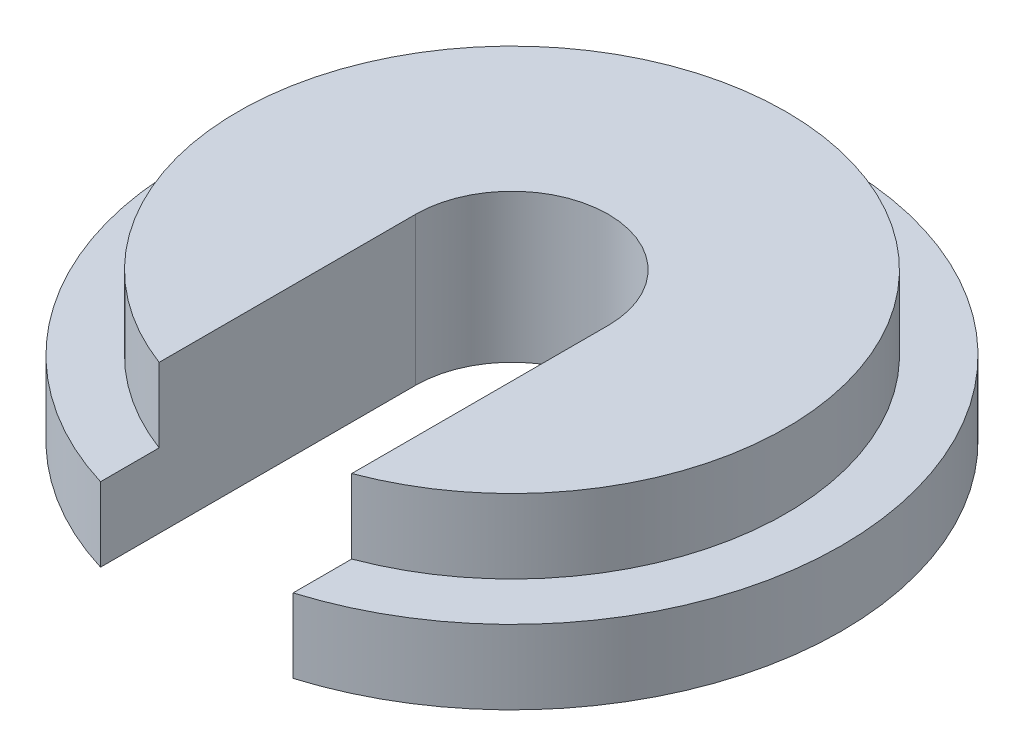
ISO-10303-21;
HEADER;
FILE_DESCRIPTION(('STEP AP214'),'2;1');
FILE_NAME('part.step','',(''),(''),'','','');
FILE_SCHEMA(('AUTOMOTIVE_DESIGN { 1 0 10303 214 1 1 1 1 }'));
ENDSEC;
DATA;
#1=APPLICATION_CONTEXT('core data for automotive mechanical design processes');
#2=APPLICATION_PROTOCOL_DEFINITION('international standard','automotive_design',2000,#1);
#3=PRODUCT_CONTEXT('',#1,'mechanical');
#4=PRODUCT('Part','Part','',(#3));
#5=PRODUCT_RELATED_PRODUCT_CATEGORY('part','',(#4));
#6=PRODUCT_DEFINITION_FORMATION('','',#4);
#7=PRODUCT_DEFINITION_CONTEXT('part definition',#1,'design');
#8=PRODUCT_DEFINITION('design','',#6,#7);
#9=PRODUCT_DEFINITION_SHAPE('','',#8);
#10=(LENGTH_UNIT() NAMED_UNIT(*) SI_UNIT(.MILLI.,.METRE.));
#11=(NAMED_UNIT(*) PLANE_ANGLE_UNIT() SI_UNIT($,.RADIAN.));
#12=(NAMED_UNIT(*) SI_UNIT($,.STERADIAN.) SOLID_ANGLE_UNIT());
#13=UNCERTAINTY_MEASURE_WITH_UNIT(LENGTH_MEASURE(1.E-05),#10,'distance_accuracy_value','');
#14=(GEOMETRIC_REPRESENTATION_CONTEXT(3) GLOBAL_UNCERTAINTY_ASSIGNED_CONTEXT((#13)) GLOBAL_UNIT_ASSIGNED_CONTEXT((#10,
#11,#12)) REPRESENTATION_CONTEXT('',''));
#15=CARTESIAN_POINT('',(0.,0.,0.));
#16=DIRECTION('',(0.,0.,1.));
#17=DIRECTION('',(1.,0.,0.));
#18=AXIS2_PLACEMENT_3D('',#15,#16,#17);
#19=CARTESIAN_POINT('',(0.,10.,0.));
#20=DIRECTION('',(0.,1.,0.));
#21=DIRECTION('',(0.,0.,1.));
#22=AXIS2_PLACEMENT_3D('',#19,#20,#21);
#23=PLANE('',#22);
#24=DIRECTION('',(0.,0.,1.));
#25=VECTOR('',#24,1.);
#26=CARTESIAN_POINT('',(-13.,10.,0.));
#27=LINE('',#26,#25);
#28=CARTESIAN_POINT('',(-13.,10.,34.6410161513775));
#29=VERTEX_POINT('',#28);
#30=CARTESIAN_POINT('',(-13.,10.,42.5587828773333));
#31=VERTEX_POINT('',#30);
#32=EDGE_CURVE('E56',#29,#31,#27,.T.);
#33=ORIENTED_EDGE('',*,*,#32,.F.);
#34=CARTESIAN_POINT('',(0.,10.,0.));
#35=DIRECTION('',(0.,1.,0.));
#36=DIRECTION('',(0.,0.,1.));
#37=AXIS2_PLACEMENT_3D('',#34,#35,#36);
#38=CIRCLE('',#37,37.);
#39=CARTESIAN_POINT('',(13.,10.,34.6410161513775));
#40=VERTEX_POINT('',#39);
#41=EDGE_CURVE('E124',#40,#29,#38,.T.);
#42=ORIENTED_EDGE('',*,*,#41,.F.);
#43=DIRECTION('',(0.,0.,-1.));
#44=VECTOR('',#43,1.);
#45=CARTESIAN_POINT('',(13.,10.,0.));
#46=LINE('',#45,#44);
#47=CARTESIAN_POINT('',(13.,10.,42.5587828773333));
#48=VERTEX_POINT('',#47);
#49=EDGE_CURVE('E113',#48,#40,#46,.T.);
#50=ORIENTED_EDGE('',*,*,#49,.F.);
#51=CARTESIAN_POINT('',(0.,10.,0.));
#52=DIRECTION('',(0.,1.,0.));
#53=DIRECTION('',(0.,0.,1.));
#54=AXIS2_PLACEMENT_3D('',#51,#52,#53);
#55=CIRCLE('',#54,44.5);
#56=EDGE_CURVE('E41',#48,#31,#55,.T.);
#57=ORIENTED_EDGE('',*,*,#56,.T.);
#58=EDGE_LOOP('',(#33,#42,#50,#57));
#59=FACE_BOUND('',#58,.T.);
#60=ADVANCED_FACE('F33',(#59),#23,.T.);
#61=CARTESIAN_POINT('',(0.,10.,0.));
#62=DIRECTION('',(0.,-1.,0.));
#63=DIRECTION('',(0.,0.,-1.));
#64=AXIS2_PLACEMENT_3D('',#61,#62,#63);
#65=CYLINDRICAL_SURFACE('',#64,44.5);
#66=CARTESIAN_POINT('',(0.,0.,0.));
#67=DIRECTION('',(0.,1.,0.));
#68=DIRECTION('',(0.,0.,1.));
#69=AXIS2_PLACEMENT_3D('',#66,#67,#68);
#70=CIRCLE('',#69,44.5);
#71=CARTESIAN_POINT('',(13.,0.,42.5587828773333));
#72=VERTEX_POINT('',#71);
#73=CARTESIAN_POINT('',(-13.,0.,42.5587828773333));
#74=VERTEX_POINT('',#73);
#75=EDGE_CURVE('E127',#72,#74,#70,.T.);
#76=ORIENTED_EDGE('',*,*,#75,.T.);
#77=DIRECTION('',(0.,-1.,0.));
#78=VECTOR('',#77,1.);
#79=CARTESIAN_POINT('',(-13.,10.,42.5587828773333));
#80=LINE('',#79,#78);
#81=EDGE_CURVE('E122',#74,#31,#80,.F.);
#82=ORIENTED_EDGE('',*,*,#81,.T.);
#83=ORIENTED_EDGE('',*,*,#56,.F.);
#84=DIRECTION('',(0.,-1.,0.));
#85=VECTOR('',#84,1.);
#86=CARTESIAN_POINT('',(13.,10.,42.5587828773333));
#87=LINE('',#86,#85);
#88=EDGE_CURVE('E115',#48,#72,#87,.T.);
#89=ORIENTED_EDGE('',*,*,#88,.T.);
#90=EDGE_LOOP('',(#76,#82,#83,#89));
#91=FACE_BOUND('',#90,.T.);
#92=ADVANCED_FACE('F35',(#91),#65,.T.);
#93=CARTESIAN_POINT('',(0.,0.,0.));
#94=DIRECTION('',(0.,1.,0.));
#95=DIRECTION('',(0.,0.,1.));
#96=AXIS2_PLACEMENT_3D('',#93,#94,#95);
#97=PLANE('',#96);
#98=CARTESIAN_POINT('',(0.,0.,0.));
#99=DIRECTION('',(0.,-1.,0.));
#100=DIRECTION('',(0.,0.,-1.));
#101=AXIS2_PLACEMENT_3D('',#98,#99,#100);
#102=CIRCLE('',#101,13.);
#103=CARTESIAN_POINT('',(-13.,0.,0.));
#104=VERTEX_POINT('',#103);
#105=CARTESIAN_POINT('',(13.,0.,0.));
#106=VERTEX_POINT('',#105);
#107=EDGE_CURVE('E93',#104,#106,#102,.T.);
#108=ORIENTED_EDGE('',*,*,#107,.F.);
#109=DIRECTION('',(0.,0.,-1.));
#110=VECTOR('',#109,1.);
#111=CARTESIAN_POINT('',(-13.,0.,0.));
#112=LINE('',#111,#110);
#113=EDGE_CURVE('E104',#74,#104,#112,.T.);
#114=ORIENTED_EDGE('',*,*,#113,.F.);
#115=ORIENTED_EDGE('',*,*,#75,.F.);
#116=DIRECTION('',(0.,0.,1.));
#117=VECTOR('',#116,1.);
#118=CARTESIAN_POINT('',(13.,0.,62.2171247482726));
#119=LINE('',#118,#117);
#120=EDGE_CURVE('E106',#106,#72,#119,.T.);
#121=ORIENTED_EDGE('',*,*,#120,.F.);
#122=EDGE_LOOP('',(#108,#114,#115,#121));
#123=FACE_BOUND('',#122,.T.);
#124=ADVANCED_FACE('F137',(#123),#97,.F.);
#125=CARTESIAN_POINT('',(0.,20.,0.));
#126=DIRECTION('',(0.,-1.,0.));
#127=DIRECTION('',(0.,0.,-1.));
#128=AXIS2_PLACEMENT_3D('',#125,#126,#127);
#129=CYLINDRICAL_SURFACE('',#128,37.);
#130=ORIENTED_EDGE('',*,*,#41,.T.);
#131=DIRECTION('',(0.,-1.,0.));
#132=VECTOR('',#131,1.);
#133=CARTESIAN_POINT('',(-13.,20.,34.6410161513775));
#134=LINE('',#133,#132);
#135=CARTESIAN_POINT('',(-13.,20.,34.6410161513775));
#136=VERTEX_POINT('',#135);
#137=EDGE_CURVE('E118',#29,#136,#134,.F.);
#138=ORIENTED_EDGE('',*,*,#137,.T.);
#139=CARTESIAN_POINT('',(0.,20.,0.));
#140=DIRECTION('',(0.,1.,0.));
#141=DIRECTION('',(0.,0.,1.));
#142=AXIS2_PLACEMENT_3D('',#139,#140,#141);
#143=CIRCLE('',#142,37.);
#144=CARTESIAN_POINT('',(13.,20.,34.6410161513775));
#145=VERTEX_POINT('',#144);
#146=EDGE_CURVE('E125',#145,#136,#143,.T.);
#147=ORIENTED_EDGE('',*,*,#146,.F.);
#148=DIRECTION('',(0.,-1.,0.));
#149=VECTOR('',#148,1.);
#150=CARTESIAN_POINT('',(13.,20.,34.6410161513775));
#151=LINE('',#150,#149);
#152=EDGE_CURVE('E48',#145,#40,#151,.T.);
#153=ORIENTED_EDGE('',*,*,#152,.T.);
#154=EDGE_LOOP('',(#130,#138,#147,#153));
#155=FACE_BOUND('',#154,.T.);
#156=ADVANCED_FACE('F140',(#155),#129,.T.);
#157=CARTESIAN_POINT('',(0.,20.,0.));
#158=DIRECTION('',(0.,1.,0.));
#159=DIRECTION('',(0.,0.,1.));
#160=AXIS2_PLACEMENT_3D('',#157,#158,#159);
#161=PLANE('',#160);
#162=DIRECTION('',(0.,0.,1.));
#163=VECTOR('',#162,1.);
#164=CARTESIAN_POINT('',(-13.,20.,0.));
#165=LINE('',#164,#163);
#166=CARTESIAN_POINT('',(-13.,20.,0.));
#167=VERTEX_POINT('',#166);
#168=EDGE_CURVE('E11',#167,#136,#165,.T.);
#169=ORIENTED_EDGE('',*,*,#168,.F.);
#170=CARTESIAN_POINT('',(0.,20.,0.));
#171=DIRECTION('',(0.,-1.,0.));
#172=DIRECTION('',(0.,0.,-1.));
#173=AXIS2_PLACEMENT_3D('',#170,#171,#172);
#174=CIRCLE('',#173,13.);
#175=CARTESIAN_POINT('',(13.,20.,0.));
#176=VERTEX_POINT('',#175);
#177=EDGE_CURVE('E90',#167,#176,#174,.T.);
#178=ORIENTED_EDGE('',*,*,#177,.T.);
#179=DIRECTION('',(0.,0.,1.));
#180=VECTOR('',#179,1.);
#181=CARTESIAN_POINT('',(13.,20.,62.2171247482726));
#182=LINE('',#181,#180);
#183=EDGE_CURVE('E96',#176,#145,#182,.T.);
#184=ORIENTED_EDGE('',*,*,#183,.T.);
#185=ORIENTED_EDGE('',*,*,#146,.T.);
#186=EDGE_LOOP('',(#169,#178,#184,#185));
#187=FACE_BOUND('',#186,.T.);
#188=ADVANCED_FACE('F103',(#187),#161,.T.);
#189=CARTESIAN_POINT('',(-13.,20.,0.));
#190=DIRECTION('',(-1.,0.,0.));
#191=DIRECTION('',(0.,0.,1.));
#192=AXIS2_PLACEMENT_3D('',#189,#190,#191);
#193=PLANE('',#192);
#194=ORIENTED_EDGE('',*,*,#113,.T.);
#195=DIRECTION('',(0.,-1.,0.));
#196=VECTOR('',#195,1.);
#197=CARTESIAN_POINT('',(-13.,20.,0.));
#198=LINE('',#197,#196);
#199=EDGE_CURVE('E95',#167,#104,#198,.T.);
#200=ORIENTED_EDGE('',*,*,#199,.F.);
#201=ORIENTED_EDGE('',*,*,#168,.T.);
#202=ORIENTED_EDGE('',*,*,#137,.F.);
#203=ORIENTED_EDGE('',*,*,#32,.T.);
#204=ORIENTED_EDGE('',*,*,#81,.F.);
#205=EDGE_LOOP('',(#194,#200,#201,#202,#203,#204));
#206=FACE_BOUND('',#205,.T.);
#207=ADVANCED_FACE('F138',(#206),#193,.F.);
#208=CARTESIAN_POINT('',(13.,20.,62.2171247482726));
#209=DIRECTION('',(1.,0.,0.));
#210=DIRECTION('',(0.,0.,-1.));
#211=AXIS2_PLACEMENT_3D('',#208,#209,#210);
#212=PLANE('',#211);
#213=ORIENTED_EDGE('',*,*,#49,.T.);
#214=ORIENTED_EDGE('',*,*,#152,.F.);
#215=ORIENTED_EDGE('',*,*,#183,.F.);
#216=DIRECTION('',(0.,-1.,0.));
#217=VECTOR('',#216,1.);
#218=CARTESIAN_POINT('',(13.,20.,0.));
#219=LINE('',#218,#217);
#220=EDGE_CURVE('E86',#176,#106,#219,.T.);
#221=ORIENTED_EDGE('',*,*,#220,.T.);
#222=ORIENTED_EDGE('',*,*,#120,.T.);
#223=ORIENTED_EDGE('',*,*,#88,.F.);
#224=EDGE_LOOP('',(#213,#214,#215,#221,#222,#223));
#225=FACE_BOUND('',#224,.T.);
#226=ADVANCED_FACE('F98',(#225),#212,.F.);
#227=CARTESIAN_POINT('',(0.,20.,0.));
#228=DIRECTION('',(0.,-1.,0.));
#229=DIRECTION('',(0.,0.,-1.));
#230=AXIS2_PLACEMENT_3D('',#227,#228,#229);
#231=CYLINDRICAL_SURFACE('',#230,13.);
#232=ORIENTED_EDGE('',*,*,#107,.T.);
#233=ORIENTED_EDGE('',*,*,#220,.F.);
#234=ORIENTED_EDGE('',*,*,#177,.F.);
#235=ORIENTED_EDGE('',*,*,#199,.T.);
#236=EDGE_LOOP('',(#232,#233,#234,#235));
#237=FACE_BOUND('',#236,.T.);
#238=ADVANCED_FACE('F87',(#237),#231,.F.);
#239=CLOSED_SHELL('',(#60,#92,#124,#156,#188,#207,#226,#238));
#240=MANIFOLD_SOLID_BREP('B2',#239);
#241=ADVANCED_BREP_SHAPE_REPRESENTATION('',(#18,#240),#14);
#242=SHAPE_DEFINITION_REPRESENTATION(#9,#241);
ENDSEC;
END-ISO-10303-21;
